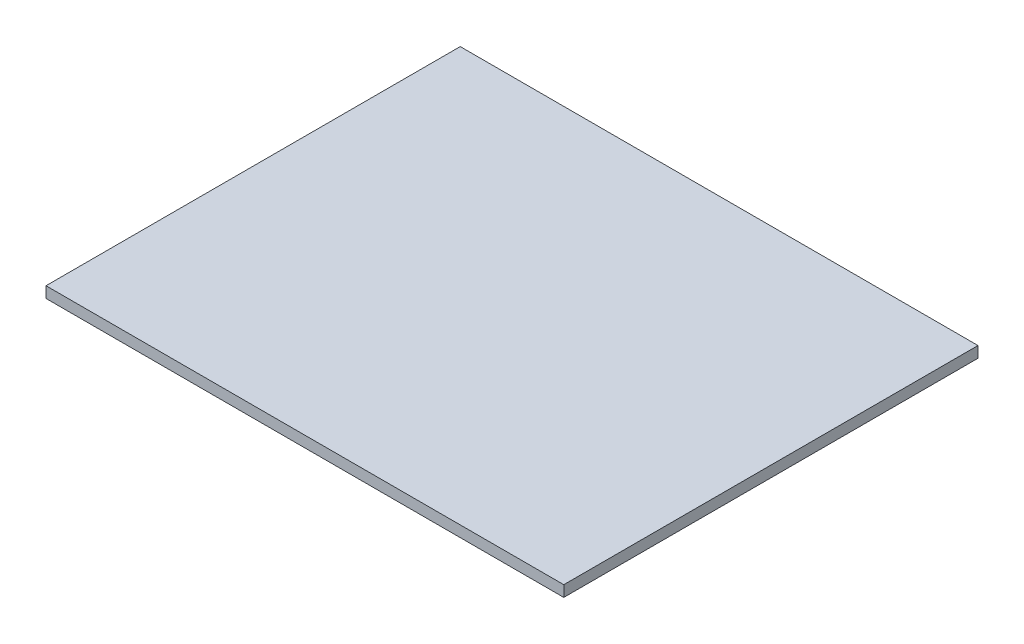
ISO-10303-21;
HEADER;
FILE_DESCRIPTION(('STEP AP214'),'2;1');
FILE_NAME('part.step','',(''),(''),'','','');
FILE_SCHEMA(('AUTOMOTIVE_DESIGN { 1 0 10303 214 1 1 1 1 }'));
ENDSEC;
DATA;
#1=APPLICATION_CONTEXT('core data for automotive mechanical design processes');
#2=APPLICATION_PROTOCOL_DEFINITION('international standard','automotive_design',2000,#1);
#3=PRODUCT_CONTEXT('',#1,'mechanical');
#4=PRODUCT('Part','Part','',(#3));
#5=PRODUCT_RELATED_PRODUCT_CATEGORY('part','',(#4));
#6=PRODUCT_DEFINITION_FORMATION('','',#4);
#7=PRODUCT_DEFINITION_CONTEXT('part definition',#1,'design');
#8=PRODUCT_DEFINITION('design','',#6,#7);
#9=PRODUCT_DEFINITION_SHAPE('','',#8);
#10=(LENGTH_UNIT() NAMED_UNIT(*) SI_UNIT(.MILLI.,.METRE.));
#11=(NAMED_UNIT(*) PLANE_ANGLE_UNIT() SI_UNIT($,.RADIAN.));
#12=(NAMED_UNIT(*) SI_UNIT($,.STERADIAN.) SOLID_ANGLE_UNIT());
#13=UNCERTAINTY_MEASURE_WITH_UNIT(LENGTH_MEASURE(1.E-05),#10,'distance_accuracy_value','');
#14=(GEOMETRIC_REPRESENTATION_CONTEXT(3) GLOBAL_UNCERTAINTY_ASSIGNED_CONTEXT((#13)) GLOBAL_UNIT_ASSIGNED_CONTEXT((#10,
#11,#12)) REPRESENTATION_CONTEXT('',''));
#15=CARTESIAN_POINT('',(0.,0.,0.));
#16=DIRECTION('',(0.,0.,1.));
#17=DIRECTION('',(1.,0.,0.));
#18=AXIS2_PLACEMENT_3D('',#15,#16,#17);
#19=CARTESIAN_POINT('',(37.5,1.6,30.));
#20=DIRECTION('',(-1.,0.,0.));
#21=DIRECTION('',(0.,0.,1.));
#22=AXIS2_PLACEMENT_3D('',#19,#20,#21);
#23=PLANE('',#22);
#24=DIRECTION('',(0.,0.,-1.));
#25=VECTOR('',#24,1.);
#26=CARTESIAN_POINT('',(37.5,0.,30.));
#27=LINE('',#26,#25);
#28=CARTESIAN_POINT('',(37.5,0.,30.));
#29=VERTEX_POINT('',#28);
#30=CARTESIAN_POINT('',(37.5,0.,-30.));
#31=VERTEX_POINT('',#30);
#32=EDGE_CURVE('E111',#29,#31,#27,.T.);
#33=ORIENTED_EDGE('',*,*,#32,.T.);
#34=DIRECTION('',(0.,-1.,0.));
#35=VECTOR('',#34,1.);
#36=CARTESIAN_POINT('',(37.5,1.6,-30.));
#37=LINE('',#36,#35);
#38=CARTESIAN_POINT('',(37.5,1.6,-30.));
#39=VERTEX_POINT('',#38);
#40=EDGE_CURVE('E11',#39,#31,#37,.T.);
#41=ORIENTED_EDGE('',*,*,#40,.F.);
#42=DIRECTION('',(0.,0.,-1.));
#43=VECTOR('',#42,1.);
#44=CARTESIAN_POINT('',(37.5,1.6,30.));
#45=LINE('',#44,#43);
#46=CARTESIAN_POINT('',(37.5,1.6,30.));
#47=VERTEX_POINT('',#46);
#48=EDGE_CURVE('E95',#47,#39,#45,.T.);
#49=ORIENTED_EDGE('',*,*,#48,.F.);
#50=DIRECTION('',(0.,-1.,0.));
#51=VECTOR('',#50,1.);
#52=CARTESIAN_POINT('',(37.5,1.6,30.));
#53=LINE('',#52,#51);
#54=EDGE_CURVE('E107',#47,#29,#53,.T.);
#55=ORIENTED_EDGE('',*,*,#54,.T.);
#56=EDGE_LOOP('',(#33,#41,#49,#55));
#57=FACE_BOUND('',#56,.T.);
#58=ADVANCED_FACE('F43',(#57),#23,.F.);
#59=CARTESIAN_POINT('',(-37.5,1.6,-30.));
#60=DIRECTION('',(0.,0.,1.));
#61=DIRECTION('',(1.,0.,0.));
#62=AXIS2_PLACEMENT_3D('',#59,#60,#61);
#63=PLANE('',#62);
#64=DIRECTION('',(-1.,0.,0.));
#65=VECTOR('',#64,1.);
#66=CARTESIAN_POINT('',(-37.5,0.,-30.));
#67=LINE('',#66,#65);
#68=CARTESIAN_POINT('',(-37.5,0.,-30.));
#69=VERTEX_POINT('',#68);
#70=EDGE_CURVE('E100',#31,#69,#67,.T.);
#71=ORIENTED_EDGE('',*,*,#70,.T.);
#72=DIRECTION('',(0.,-1.,0.));
#73=VECTOR('',#72,1.);
#74=CARTESIAN_POINT('',(-37.5,1.6,-30.));
#75=LINE('',#74,#73);
#76=CARTESIAN_POINT('',(-37.5,1.6,-30.));
#77=VERTEX_POINT('',#76);
#78=EDGE_CURVE('E52',#77,#69,#75,.T.);
#79=ORIENTED_EDGE('',*,*,#78,.F.);
#80=DIRECTION('',(-1.,0.,0.));
#81=VECTOR('',#80,1.);
#82=CARTESIAN_POINT('',(-37.5,1.6,-30.));
#83=LINE('',#82,#81);
#84=EDGE_CURVE('E90',#39,#77,#83,.T.);
#85=ORIENTED_EDGE('',*,*,#84,.F.);
#86=ORIENTED_EDGE('',*,*,#40,.T.);
#87=EDGE_LOOP('',(#71,#79,#85,#86));
#88=FACE_BOUND('',#87,.T.);
#89=ADVANCED_FACE('F99',(#88),#63,.F.);
#90=CARTESIAN_POINT('',(-37.5,1.6,30.));
#91=DIRECTION('',(1.,0.,0.));
#92=DIRECTION('',(0.,0.,-1.));
#93=AXIS2_PLACEMENT_3D('',#90,#91,#92);
#94=PLANE('',#93);
#95=DIRECTION('',(0.,0.,1.));
#96=VECTOR('',#95,1.);
#97=CARTESIAN_POINT('',(-37.5,0.,30.));
#98=LINE('',#97,#96);
#99=CARTESIAN_POINT('',(-37.5,0.,30.));
#100=VERTEX_POINT('',#99);
#101=EDGE_CURVE('E77',#69,#100,#98,.T.);
#102=ORIENTED_EDGE('',*,*,#101,.T.);
#103=DIRECTION('',(0.,-1.,0.));
#104=VECTOR('',#103,1.);
#105=CARTESIAN_POINT('',(-37.5,1.6,30.));
#106=LINE('',#105,#104);
#107=CARTESIAN_POINT('',(-37.5,1.6,30.));
#108=VERTEX_POINT('',#107);
#109=EDGE_CURVE('E102',#108,#100,#106,.T.);
#110=ORIENTED_EDGE('',*,*,#109,.F.);
#111=DIRECTION('',(0.,0.,1.));
#112=VECTOR('',#111,1.);
#113=CARTESIAN_POINT('',(-37.5,1.6,30.));
#114=LINE('',#113,#112);
#115=EDGE_CURVE('E93',#77,#108,#114,.T.);
#116=ORIENTED_EDGE('',*,*,#115,.F.);
#117=ORIENTED_EDGE('',*,*,#78,.T.);
#118=EDGE_LOOP('',(#102,#110,#116,#117));
#119=FACE_BOUND('',#118,.T.);
#120=ADVANCED_FACE('F103',(#119),#94,.F.);
#121=CARTESIAN_POINT('',(-37.5,1.6,30.));
#122=DIRECTION('',(0.,0.,-1.));
#123=DIRECTION('',(-1.,0.,0.));
#124=AXIS2_PLACEMENT_3D('',#121,#122,#123);
#125=PLANE('',#124);
#126=DIRECTION('',(1.,0.,0.));
#127=VECTOR('',#126,1.);
#128=CARTESIAN_POINT('',(-37.5,0.,30.));
#129=LINE('',#128,#127);
#130=EDGE_CURVE('E83',#100,#29,#129,.T.);
#131=ORIENTED_EDGE('',*,*,#130,.T.);
#132=ORIENTED_EDGE('',*,*,#54,.F.);
#133=DIRECTION('',(1.,0.,0.));
#134=VECTOR('',#133,1.);
#135=CARTESIAN_POINT('',(-37.5,1.6,30.));
#136=LINE('',#135,#134);
#137=EDGE_CURVE('E60',#108,#47,#136,.T.);
#138=ORIENTED_EDGE('',*,*,#137,.F.);
#139=ORIENTED_EDGE('',*,*,#109,.T.);
#140=EDGE_LOOP('',(#131,#132,#138,#139));
#141=FACE_BOUND('',#140,.T.);
#142=ADVANCED_FACE('F124',(#141),#125,.F.);
#143=CARTESIAN_POINT('',(0.,1.6,0.));
#144=DIRECTION('',(0.,-1.,0.));
#145=DIRECTION('',(0.,0.,-1.));
#146=AXIS2_PLACEMENT_3D('',#143,#144,#145);
#147=PLANE('',#146);
#148=ORIENTED_EDGE('',*,*,#48,.T.);
#149=ORIENTED_EDGE('',*,*,#84,.T.);
#150=ORIENTED_EDGE('',*,*,#115,.T.);
#151=ORIENTED_EDGE('',*,*,#137,.T.);
#152=EDGE_LOOP('',(#148,#149,#150,#151));
#153=FACE_BOUND('',#152,.T.);
#154=ADVANCED_FACE('F91',(#153),#147,.F.);
#155=CARTESIAN_POINT('',(0.,0.,0.));
#156=DIRECTION('',(0.,-1.,0.));
#157=DIRECTION('',(0.,0.,-1.));
#158=AXIS2_PLACEMENT_3D('',#155,#156,#157);
#159=PLANE('',#158);
#160=ORIENTED_EDGE('',*,*,#32,.F.);
#161=ORIENTED_EDGE('',*,*,#130,.F.);
#162=ORIENTED_EDGE('',*,*,#101,.F.);
#163=ORIENTED_EDGE('',*,*,#70,.F.);
#164=EDGE_LOOP('',(#160,#161,#162,#163));
#165=FACE_BOUND('',#164,.T.);
#166=ADVANCED_FACE('F127',(#165),#159,.T.);
#167=CLOSED_SHELL('',(#58,#89,#120,#142,#154,#166));
#168=MANIFOLD_SOLID_BREP('B2',#167);
#169=ADVANCED_BREP_SHAPE_REPRESENTATION('',(#18,#168),#14);
#170=SHAPE_DEFINITION_REPRESENTATION(#9,#169);
ENDSEC;
END-ISO-10303-21;
